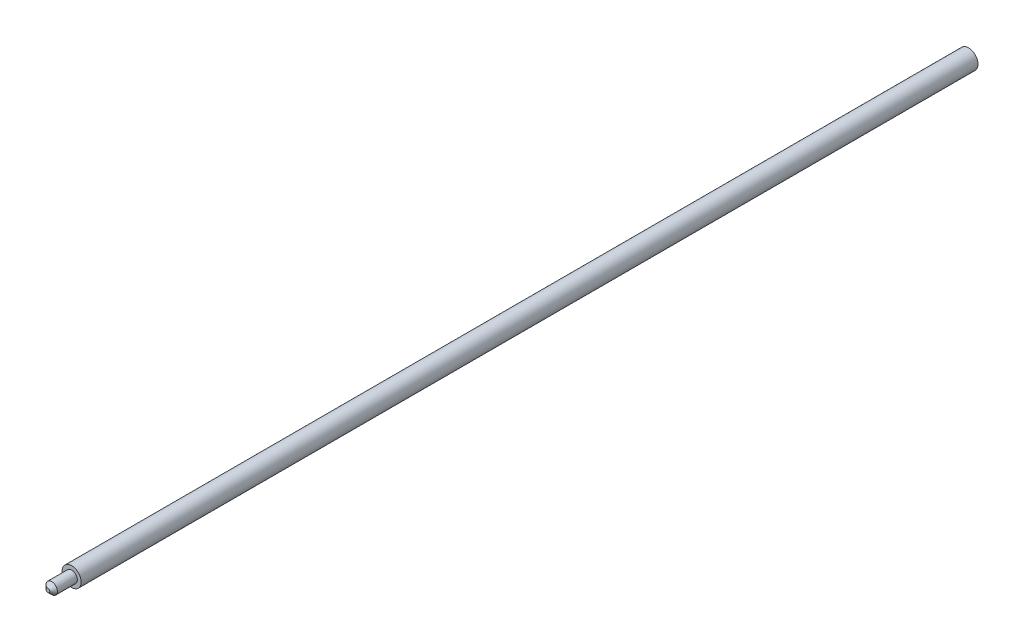
ISO-10303-21;
HEADER;
FILE_DESCRIPTION(('STEP AP214'),'2;1');
FILE_NAME('part.step','',(''),(''),'','','');
FILE_SCHEMA(('AUTOMOTIVE_DESIGN { 1 0 10303 214 1 1 1 1 }'));
ENDSEC;
DATA;
#1=APPLICATION_CONTEXT('core data for automotive mechanical design processes');
#2=APPLICATION_PROTOCOL_DEFINITION('international standard','automotive_design',2000,#1);
#3=PRODUCT_CONTEXT('',#1,'mechanical');
#4=PRODUCT('Part','Part','',(#3));
#5=PRODUCT_RELATED_PRODUCT_CATEGORY('part','',(#4));
#6=PRODUCT_DEFINITION_FORMATION('','',#4);
#7=PRODUCT_DEFINITION_CONTEXT('part definition',#1,'design');
#8=PRODUCT_DEFINITION('design','',#6,#7);
#9=PRODUCT_DEFINITION_SHAPE('','',#8);
#10=(LENGTH_UNIT() NAMED_UNIT(*) SI_UNIT(.MILLI.,.METRE.));
#11=(NAMED_UNIT(*) PLANE_ANGLE_UNIT() SI_UNIT($,.RADIAN.));
#12=(NAMED_UNIT(*) SI_UNIT($,.STERADIAN.) SOLID_ANGLE_UNIT());
#13=UNCERTAINTY_MEASURE_WITH_UNIT(LENGTH_MEASURE(1.E-05),#10,'distance_accuracy_value','');
#14=(GEOMETRIC_REPRESENTATION_CONTEXT(3) GLOBAL_UNCERTAINTY_ASSIGNED_CONTEXT((#13)) GLOBAL_UNIT_ASSIGNED_CONTEXT((#10,
#11,#12)) REPRESENTATION_CONTEXT('',''));
#15=CARTESIAN_POINT('',(0.,0.,0.));
#16=DIRECTION('',(0.,0.,1.));
#17=DIRECTION('',(1.,0.,0.));
#18=AXIS2_PLACEMENT_3D('',#15,#16,#17);
#19=CARTESIAN_POINT('',(0.,0.,119.9642));
#20=DIRECTION('',(0.,0.,-1.));
#21=DIRECTION('',(-1.,0.,0.));
#22=AXIS2_PLACEMENT_3D('',#19,#20,#21);
#23=CYLINDRICAL_SURFACE('',#22,1.27);
#24=CARTESIAN_POINT('',(0.,0.,119.9642));
#25=DIRECTION('',(0.,0.,1.));
#26=DIRECTION('',(1.,0.,0.));
#27=AXIS2_PLACEMENT_3D('',#24,#25,#26);
#28=CIRCLE('',#27,1.27);
#29=CARTESIAN_POINT('',(-1.27,0.,119.9642));
#30=VERTEX_POINT('',#29);
#31=EDGE_CURVE('E51',#30,#30,#28,.T.);
#32=CARTESIAN_POINT('',(0.,0.,0.));
#33=DIRECTION('',(0.,0.,1.));
#34=DIRECTION('',(1.,0.,0.));
#35=AXIS2_PLACEMENT_3D('',#32,#33,#34);
#36=CIRCLE('',#35,1.27);
#37=CARTESIAN_POINT('',(-1.27,0.,0.));
#38=VERTEX_POINT('',#37);
#39=EDGE_CURVE('E54',#38,#38,#36,.T.);
#40=CARTESIAN_POINT('',(-1.27,0.,119.9642));
#41=CARTESIAN_POINT('',(-1.27,0.,118.714572916667));
#42=CARTESIAN_POINT('',(-1.27,0.,117.464945833333));
#43=CARTESIAN_POINT('',(-1.27,0.,114.965691666667));
#44=CARTESIAN_POINT('',(-1.27,0.,113.716064583333));
#45=CARTESIAN_POINT('',(-1.27,0.,111.216810416667));
#46=CARTESIAN_POINT('',(-1.27,0.,109.967183333333));
#47=CARTESIAN_POINT('',(-1.27,0.,107.467929166667));
#48=CARTESIAN_POINT('',(-1.27,0.,106.218302083333));
#49=CARTESIAN_POINT('',(-1.27,0.,103.719047916667));
#50=CARTESIAN_POINT('',(-1.27,0.,102.469420833333));
#51=CARTESIAN_POINT('',(-1.27,0.,99.9701666666667));
#52=CARTESIAN_POINT('',(-1.27,0.,98.7205395833333));
#53=CARTESIAN_POINT('',(-1.27,0.,96.2212854166667));
#54=CARTESIAN_POINT('',(-1.27,0.,94.9716583333333));
#55=CARTESIAN_POINT('',(-1.27,0.,92.4724041666667));
#56=CARTESIAN_POINT('',(-1.27,0.,91.2227770833333));
#57=CARTESIAN_POINT('',(-1.27,0.,88.7235229166667));
#58=CARTESIAN_POINT('',(-1.27,0.,87.4738958333333));
#59=CARTESIAN_POINT('',(-1.27,0.,84.9746416666667));
#60=CARTESIAN_POINT('',(-1.27,0.,83.7250145833333));
#61=CARTESIAN_POINT('',(-1.27,0.,81.2257604166667));
#62=CARTESIAN_POINT('',(-1.27,0.,79.9761333333333));
#63=CARTESIAN_POINT('',(-1.27,0.,77.4768791666667));
#64=CARTESIAN_POINT('',(-1.27,0.,76.2272520833333));
#65=CARTESIAN_POINT('',(-1.27,0.,73.7279979166667));
#66=CARTESIAN_POINT('',(-1.27,0.,72.4783708333333));
#67=CARTESIAN_POINT('',(-1.27,0.,69.9791166666667));
#68=CARTESIAN_POINT('',(-1.27,0.,68.7294895833333));
#69=CARTESIAN_POINT('',(-1.27,0.,66.2302354166667));
#70=CARTESIAN_POINT('',(-1.27,0.,64.9806083333333));
#71=CARTESIAN_POINT('',(-1.27,0.,62.4813541666667));
#72=CARTESIAN_POINT('',(-1.27,0.,61.2317270833333));
#73=CARTESIAN_POINT('',(-1.27,0.,58.7324729166667));
#74=CARTESIAN_POINT('',(-1.27,0.,57.4828458333333));
#75=CARTESIAN_POINT('',(-1.27,0.,54.9835916666667));
#76=CARTESIAN_POINT('',(-1.27,0.,53.7339645833333));
#77=CARTESIAN_POINT('',(-1.27,0.,51.2347104166667));
#78=CARTESIAN_POINT('',(-1.27,0.,49.9850833333333));
#79=CARTESIAN_POINT('',(-1.27,0.,47.4858291666667));
#80=CARTESIAN_POINT('',(-1.27,0.,46.2362020833333));
#81=CARTESIAN_POINT('',(-1.27,0.,43.7369479166667));
#82=CARTESIAN_POINT('',(-1.27,0.,42.4873208333333));
#83=CARTESIAN_POINT('',(-1.27,0.,39.9880666666666));
#84=CARTESIAN_POINT('',(-1.27,0.,38.7384395833333));
#85=CARTESIAN_POINT('',(-1.27,0.,36.2391854166667));
#86=CARTESIAN_POINT('',(-1.27,0.,34.9895583333333));
#87=CARTESIAN_POINT('',(-1.27,0.,32.4903041666667));
#88=CARTESIAN_POINT('',(-1.27,0.,31.2406770833333));
#89=CARTESIAN_POINT('',(-1.27,0.,28.7414229166667));
#90=CARTESIAN_POINT('',(-1.27,0.,27.4917958333333));
#91=CARTESIAN_POINT('',(-1.27,0.,24.9925416666667));
#92=CARTESIAN_POINT('',(-1.27,0.,23.7429145833333));
#93=CARTESIAN_POINT('',(-1.27,0.,21.2436604166667));
#94=CARTESIAN_POINT('',(-1.27,0.,19.9940333333333));
#95=CARTESIAN_POINT('',(-1.27,0.,17.4947791666666));
#96=CARTESIAN_POINT('',(-1.27,0.,16.2451520833333));
#97=CARTESIAN_POINT('',(-1.27,0.,13.7458979166667));
#98=CARTESIAN_POINT('',(-1.27,0.,12.4962708333333));
#99=CARTESIAN_POINT('',(-1.27,0.,9.99701666666666));
#100=CARTESIAN_POINT('',(-1.27,0.,8.74738958333332));
#101=CARTESIAN_POINT('',(-1.27,0.,6.24813541666666));
#102=CARTESIAN_POINT('',(-1.27,0.,4.99850833333332));
#103=CARTESIAN_POINT('',(-1.27,0.,2.49925416666666));
#104=CARTESIAN_POINT('',(-1.27,0.,1.24962708333332));
#105=CARTESIAN_POINT('',(-1.27,0.,0.));
#106=B_SPLINE_CURVE_WITH_KNOTS('',3,(#40,#41,#42,#43,#44,#45,#46,#47,#48,#49,#50,#51,#52,#53,
#54,#55,#56,#57,#58,#59,#60,#61,#62,#63,#64,#65,#66,#67,#68,#69,#70,#71,#72,#73,#74,#75,#76,#77,
#78,#79,#80,#81,#82,#83,#84,#85,#86,#87,#88,#89,#90,#91,#92,#93,#94,#95,#96,#97,#98,#99,#100,
#101,#102,#103,#104,#105),.UNSPECIFIED.,.F.,.F.,(4,2,2,2,2,2,2,2,2,2,2,2,2,2,2,2,2,2,2,2,2,2,2,
2,2,2,2,2,2,2,2,2,4),(0.,3.74888124999999,7.49776249999999,11.24664375,14.995525,18.74440625,
22.4932875,26.24216875,29.99105,33.73993125,37.4888125,41.23769375,44.986575,48.73545625,
52.4843375,56.23321875,59.9821,63.73098125,67.4798625,71.22874375,74.977625,78.72650625,
82.4753875,86.22426875,89.97315,93.72203125,97.4709125,101.21979375,104.968675,108.71755625,
112.4664375,116.21531875,119.9642),.UNSPECIFIED.);
#107=EDGE_CURVE('BSEAM35',#30,#38,#106,.T.);
#108=ORIENTED_EDGE('',*,*,#31,.F.);
#109=ORIENTED_EDGE('',*,*,#39,.T.);
#110=ORIENTED_EDGE('',*,*,#107,.T.);
#111=ORIENTED_EDGE('',*,*,#107,.F.);
#112=EDGE_LOOP('',(#108,#110,#109,#111));
#113=FACE_BOUND('',#112,.T.);
#114=ADVANCED_FACE('F35',(#113),#23,.T.);
#115=CARTESIAN_POINT('',(0.,0.,119.9642));
#116=DIRECTION('',(0.,0.,1.));
#117=DIRECTION('',(1.,0.,0.));
#118=AXIS2_PLACEMENT_3D('',#115,#116,#117);
#119=PLANE('',#118);
#120=CARTESIAN_POINT('',(0.,0.,119.9642));
#121=DIRECTION('',(0.,0.,1.));
#122=DIRECTION('',(1.,0.,0.));
#123=AXIS2_PLACEMENT_3D('',#120,#121,#122);
#124=CIRCLE('',#123,0.762);
#125=CARTESIAN_POINT('',(0.762,0.,119.9642));
#126=VERTEX_POINT('',#125);
#127=EDGE_CURVE('E47',#126,#126,#124,.T.);
#128=ORIENTED_EDGE('',*,*,#127,.F.);
#129=EDGE_LOOP('',(#128));
#130=FACE_BOUND('',#129,.T.);
#131=ORIENTED_EDGE('',*,*,#31,.T.);
#132=EDGE_LOOP('',(#131));
#133=FACE_BOUND('',#132,.T.);
#134=ADVANCED_FACE('F60',(#130,#133),#119,.T.);
#135=CARTESIAN_POINT('',(0.,0.,0.));
#136=DIRECTION('',(0.,0.,1.));
#137=DIRECTION('',(1.,0.,0.));
#138=AXIS2_PLACEMENT_3D('',#135,#136,#137);
#139=PLANE('',#138);
#140=ORIENTED_EDGE('',*,*,#39,.F.);
#141=EDGE_LOOP('',(#140));
#142=FACE_BOUND('',#141,.T.);
#143=ADVANCED_FACE('F66',(#142),#139,.F.);
#144=CARTESIAN_POINT('',(0.,0.,123.1392));
#145=DIRECTION('',(0.,0.,-1.));
#146=DIRECTION('',(-1.,0.,0.));
#147=AXIS2_PLACEMENT_3D('',#144,#145,#146);
#148=CYLINDRICAL_SURFACE('',#147,0.762);
#149=CARTESIAN_POINT('',(0.,0.,122.6312));
#150=DIRECTION('',(0.,0.,1.));
#151=DIRECTION('',(1.,0.,0.));
#152=AXIS2_PLACEMENT_3D('',#149,#150,#151);
#153=CIRCLE('',#152,0.762);
#154=CARTESIAN_POINT('',(-0.762000000000007,0.,122.6312));
#155=VERTEX_POINT('',#154);
#156=EDGE_CURVE('E10',#155,#155,#153,.F.);
#157=ORIENTED_EDGE('',*,*,#156,.T.);
#158=EDGE_LOOP('',(#157));
#159=FACE_BOUND('',#158,.T.);
#160=ORIENTED_EDGE('',*,*,#127,.T.);
#161=EDGE_LOOP('',(#160));
#162=FACE_BOUND('',#161,.T.);
#163=ADVANCED_FACE('F68',(#159,#162),#148,.T.);
#164=CARTESIAN_POINT('',(0.,0.,123.1392));
#165=DIRECTION('',(0.,0.,1.));
#166=DIRECTION('',(1.,0.,0.));
#167=AXIS2_PLACEMENT_3D('',#164,#165,#166);
#168=PLANE('',#167);
#169=CARTESIAN_POINT('',(0.,0.,123.1392));
#170=DIRECTION('',(0.,0.,1.));
#171=DIRECTION('',(1.,0.,0.));
#172=AXIS2_PLACEMENT_3D('',#169,#170,#171);
#173=CIRCLE('',#172,0.254000000000004);
#174=CARTESIAN_POINT('',(-0.254000000000011,0.,123.1392));
#175=VERTEX_POINT('',#174);
#176=EDGE_CURVE('E43',#175,#175,#173,.T.);
#177=ORIENTED_EDGE('',*,*,#176,.T.);
#178=EDGE_LOOP('',(#177));
#179=FACE_BOUND('',#178,.T.);
#180=ADVANCED_FACE('F74',(#179),#168,.T.);
#181=CARTESIAN_POINT('',(0.,0.,123.1392));
#182=DIRECTION('',(0.,0.,-1.));
#183=DIRECTION('',(-1.,0.,0.));
#184=AXIS2_PLACEMENT_3D('',#181,#182,#183);
#185=CONICAL_SURFACE('',#184,0.254000000000004,0.78539816339745);
#186=CARTESIAN_POINT('',(-0.762000000000007,0.,122.6312));
#187=CARTESIAN_POINT('',(-0.75670833333334,0.,122.636491666667));
#188=CARTESIAN_POINT('',(-0.751416666666674,0.,122.641783333333));
#189=CARTESIAN_POINT('',(-0.74083333333334,0.,122.652366666667));
#190=CARTESIAN_POINT('',(-0.735541666666674,0.,122.657658333333));
#191=CARTESIAN_POINT('',(-0.724958333333341,0.,122.668241666667));
#192=CARTESIAN_POINT('',(-0.719666666666674,0.,122.673533333333));
#193=CARTESIAN_POINT('',(-0.709083333333341,0.,122.684116666667));
#194=CARTESIAN_POINT('',(-0.703791666666674,0.,122.689408333333));
#195=CARTESIAN_POINT('',(-0.693208333333341,0.,122.699991666667));
#196=CARTESIAN_POINT('',(-0.687916666666674,0.,122.705283333333));
#197=CARTESIAN_POINT('',(-0.677333333333341,0.,122.715866666667));
#198=CARTESIAN_POINT('',(-0.672041666666674,0.,122.721158333333));
#199=CARTESIAN_POINT('',(-0.661458333333341,0.,122.731741666667));
#200=CARTESIAN_POINT('',(-0.656166666666675,0.,122.737033333333));
#201=CARTESIAN_POINT('',(-0.645583333333341,0.,122.747616666667));
#202=CARTESIAN_POINT('',(-0.640291666666674,0.,122.752908333333));
#203=CARTESIAN_POINT('',(-0.629708333333342,0.,122.763491666667));
#204=CARTESIAN_POINT('',(-0.624416666666675,0.,122.768783333333));
#205=CARTESIAN_POINT('',(-0.613833333333341,0.,122.779366666667));
#206=CARTESIAN_POINT('',(-0.608541666666673,0.,122.784658333333));
#207=CARTESIAN_POINT('',(-0.597958333333341,0.,122.795241666667));
#208=CARTESIAN_POINT('',(-0.592666666666676,0.,122.800533333333));
#209=CARTESIAN_POINT('',(-0.582083333333343,0.,122.811116666667));
#210=CARTESIAN_POINT('',(-0.576791666666676,0.,122.816408333333));
#211=CARTESIAN_POINT('',(-0.566208333333342,0.,122.826991666667));
#212=CARTESIAN_POINT('',(-0.560916666666675,0.,122.832283333333));
#213=CARTESIAN_POINT('',(-0.550333333333342,0.,122.842866666667));
#214=CARTESIAN_POINT('',(-0.545041666666675,0.,122.848158333333));
#215=CARTESIAN_POINT('',(-0.534458333333342,0.,122.858741666667));
#216=CARTESIAN_POINT('',(-0.529166666666675,0.,122.864033333333));
#217=CARTESIAN_POINT('',(-0.518583333333342,0.,122.874616666667));
#218=CARTESIAN_POINT('',(-0.513291666666676,0.,122.879908333333));
#219=CARTESIAN_POINT('',(-0.502708333333342,0.,122.890491666667));
#220=CARTESIAN_POINT('',(-0.497416666666676,0.,122.895783333333));
#221=CARTESIAN_POINT('',(-0.486833333333343,0.,122.906366666667));
#222=CARTESIAN_POINT('',(-0.481541666666676,0.,122.911658333333));
#223=CARTESIAN_POINT('',(-0.470958333333343,0.,122.922241666667));
#224=CARTESIAN_POINT('',(-0.465666666666676,0.,122.927533333333));
#225=CARTESIAN_POINT('',(-0.455083333333343,0.,122.938116666667));
#226=CARTESIAN_POINT('',(-0.449791666666677,0.,122.943408333333));
#227=CARTESIAN_POINT('',(-0.439208333333343,0.,122.953991666667));
#228=CARTESIAN_POINT('',(-0.433916666666675,0.,122.959283333333));
#229=CARTESIAN_POINT('',(-0.423333333333342,0.,122.969866666667));
#230=CARTESIAN_POINT('',(-0.418041666666677,0.,122.975158333333));
#231=CARTESIAN_POINT('',(-0.407458333333345,0.,122.985741666667));
#232=CARTESIAN_POINT('',(-0.402166666666677,0.,122.991033333333));
#233=CARTESIAN_POINT('',(-0.391583333333343,0.,123.001616666667));
#234=CARTESIAN_POINT('',(-0.386291666666677,0.,123.006908333333));
#235=CARTESIAN_POINT('',(-0.375708333333344,0.,123.017491666667));
#236=CARTESIAN_POINT('',(-0.370416666666677,0.,123.022783333333));
#237=CARTESIAN_POINT('',(-0.359833333333344,0.,123.033366666667));
#238=CARTESIAN_POINT('',(-0.354541666666677,0.,123.038658333333));
#239=CARTESIAN_POINT('',(-0.343958333333344,0.,123.049241666667));
#240=CARTESIAN_POINT('',(-0.338666666666677,0.,123.054533333333));
#241=CARTESIAN_POINT('',(-0.328083333333344,0.,123.065116666667));
#242=CARTESIAN_POINT('',(-0.322791666666677,0.,123.070408333333));
#243=CARTESIAN_POINT('',(-0.312208333333344,0.,123.080991666667));
#244=CARTESIAN_POINT('',(-0.306916666666677,0.,123.086283333333));
#245=CARTESIAN_POINT('',(-0.296333333333344,0.,123.096866666667));
#246=CARTESIAN_POINT('',(-0.291041666666678,0.,123.102158333333));
#247=CARTESIAN_POINT('',(-0.280458333333344,0.,123.112741666667));
#248=CARTESIAN_POINT('',(-0.275166666666678,0.,123.118033333333));
#249=CARTESIAN_POINT('',(-0.264583333333344,0.,123.128616666667));
#250=CARTESIAN_POINT('',(-0.259291666666678,0.,123.133908333333));
#251=CARTESIAN_POINT('',(-0.254000000000011,0.,123.1392));
#252=B_SPLINE_CURVE_WITH_KNOTS('',3,(#186,#187,#188,#189,#190,#191,#192,#193,#194,#195,#196,
#197,#198,#199,#200,#201,#202,#203,#204,#205,#206,#207,#208,#209,#210,#211,#212,#213,#214,#215,
#216,#217,#218,#219,#220,#221,#222,#223,#224,#225,#226,#227,#228,#229,#230,#231,#232,#233,#234,
#235,#236,#237,#238,#239,#240,#241,#242,#243,#244,#245,#246,#247,#248,#249,#250,#251),
.UNSPECIFIED.,.F.,.F.,(4,2,2,2,2,2,2,2,2,2,2,2,2,2,2,2,2,2,2,2,2,2,2,2,2,2,2,2,2,2,2,2,4),(0.,
0.0224506403026717,0.0449012806053435,0.0673519209080152,0.089802561210687,0.112253201513359,
0.13470384181603,0.157154482118702,0.179605122421374,0.202055762724046,0.224506403026717,
0.246957043329399,0.269407683632071,0.291858323934743,0.314308964237414,0.336759604540086,
0.359210244842758,0.38166088514543,0.404111525448101,0.426562165750773,0.449012806053445,
0.471463446356116,0.493914086658798,0.51636472696147,0.538815367264141,0.561266007566813,
0.583716647869485,0.606167288172157,0.628617928474829,0.6510685687775,0.673519209080172,
0.695969849382844,0.718420489685516),.UNSPECIFIED.);
#253=EDGE_CURVE('BSEAM38',#155,#175,#252,.T.);
#254=ORIENTED_EDGE('',*,*,#156,.F.);
#255=ORIENTED_EDGE('',*,*,#176,.F.);
#256=ORIENTED_EDGE('',*,*,#253,.T.);
#257=ORIENTED_EDGE('',*,*,#253,.F.);
#258=EDGE_LOOP('',(#254,#256,#255,#257));
#259=FACE_BOUND('',#258,.T.);
#260=ADVANCED_FACE('F38',(#259),#185,.T.);
#261=CLOSED_SHELL('',(#114,#134,#143,#163,#180,#260));
#262=MANIFOLD_SOLID_BREP('B2',#261);
#263=ADVANCED_BREP_SHAPE_REPRESENTATION('',(#18,#262),#14);
#264=SHAPE_DEFINITION_REPRESENTATION(#9,#263);
ENDSEC;
END-ISO-10303-21;
